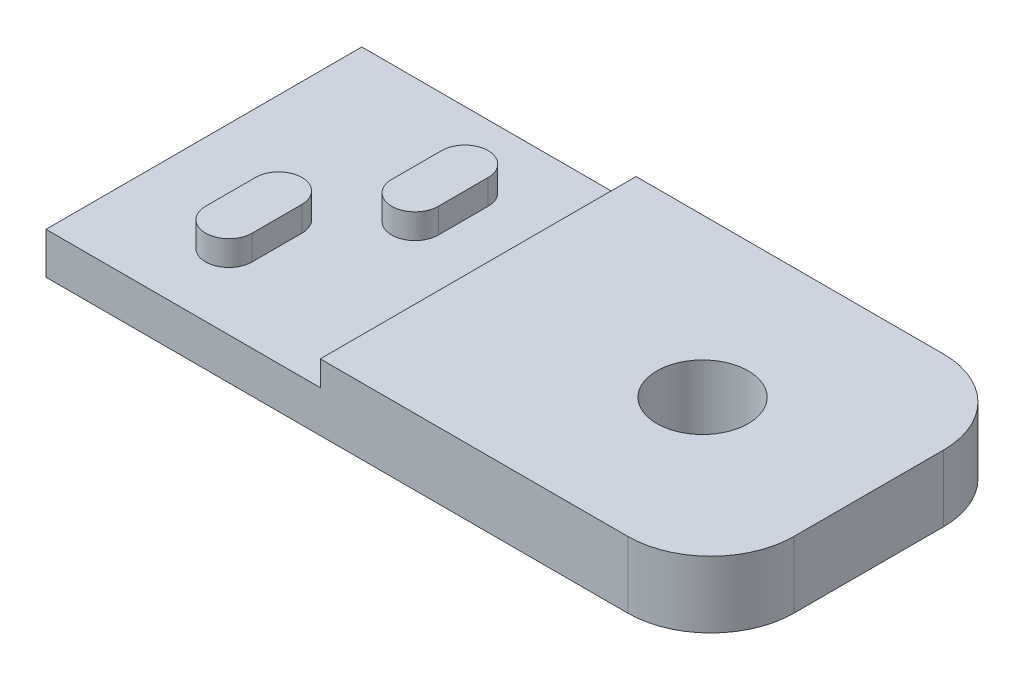
ISO-10303-21;
HEADER;
FILE_DESCRIPTION(('STEP AP214'),'2;1');
FILE_NAME('part.step','',(''),(''),'','','');
FILE_SCHEMA(('AUTOMOTIVE_DESIGN { 1 0 10303 214 1 1 1 1 }'));
ENDSEC;
DATA;
#1=APPLICATION_CONTEXT('core data for automotive mechanical design processes');
#2=APPLICATION_PROTOCOL_DEFINITION('international standard','automotive_design',2000,#1);
#3=PRODUCT_CONTEXT('',#1,'mechanical');
#4=PRODUCT('Part','Part','',(#3));
#5=PRODUCT_RELATED_PRODUCT_CATEGORY('part','',(#4));
#6=PRODUCT_DEFINITION_FORMATION('','',#4);
#7=PRODUCT_DEFINITION_CONTEXT('part definition',#1,'design');
#8=PRODUCT_DEFINITION('design','',#6,#7);
#9=PRODUCT_DEFINITION_SHAPE('','',#8);
#10=(LENGTH_UNIT() NAMED_UNIT(*) SI_UNIT(.MILLI.,.METRE.));
#11=(NAMED_UNIT(*) PLANE_ANGLE_UNIT() SI_UNIT($,.RADIAN.));
#12=(NAMED_UNIT(*) SI_UNIT($,.STERADIAN.) SOLID_ANGLE_UNIT());
#13=UNCERTAINTY_MEASURE_WITH_UNIT(LENGTH_MEASURE(1.E-05),#10,'distance_accuracy_value','');
#14=(GEOMETRIC_REPRESENTATION_CONTEXT(3) GLOBAL_UNCERTAINTY_ASSIGNED_CONTEXT((#13)) GLOBAL_UNIT_ASSIGNED_CONTEXT((#10,
#11,#12)) REPRESENTATION_CONTEXT('',''));
#15=CARTESIAN_POINT('',(0.,0.,0.));
#16=DIRECTION('',(0.,0.,1.));
#17=DIRECTION('',(1.,0.,0.));
#18=AXIS2_PLACEMENT_3D('',#15,#16,#17);
#19=CARTESIAN_POINT('',(-20.,4.,-9.5));
#20=DIRECTION('',(1.,0.,0.));
#21=DIRECTION('',(0.,0.,-1.));
#22=AXIS2_PLACEMENT_3D('',#19,#20,#21);
#23=PLANE('',#22);
#24=DIRECTION('',(0.,0.,1.));
#25=VECTOR('',#24,1.);
#26=CARTESIAN_POINT('',(-20.,2.5,-9.5));
#27=LINE('',#26,#25);
#28=CARTESIAN_POINT('',(-20.,2.5,-9.5));
#29=VERTEX_POINT('',#28);
#30=CARTESIAN_POINT('',(-20.,2.5,9.5));
#31=VERTEX_POINT('',#30);
#32=EDGE_CURVE('E227',#29,#31,#27,.T.);
#33=ORIENTED_EDGE('',*,*,#32,.F.);
#34=DIRECTION('',(0.,-1.,0.));
#35=VECTOR('',#34,1.);
#36=CARTESIAN_POINT('',(-20.,4.,-9.5));
#37=LINE('',#36,#35);
#38=CARTESIAN_POINT('',(-20.,0.,-9.5));
#39=VERTEX_POINT('',#38);
#40=EDGE_CURVE('E268',#29,#39,#37,.T.);
#41=ORIENTED_EDGE('',*,*,#40,.T.);
#42=DIRECTION('',(0.,0.,1.));
#43=VECTOR('',#42,1.);
#44=CARTESIAN_POINT('',(-20.,0.,-9.5));
#45=LINE('',#44,#43);
#46=CARTESIAN_POINT('',(-20.,0.,9.5));
#47=VERTEX_POINT('',#46);
#48=EDGE_CURVE('E263',#39,#47,#45,.T.);
#49=ORIENTED_EDGE('',*,*,#48,.T.);
#50=DIRECTION('',(0.,-1.,0.));
#51=VECTOR('',#50,1.);
#52=CARTESIAN_POINT('',(-20.,4.,9.5));
#53=LINE('',#52,#51);
#54=EDGE_CURVE('E258',#31,#47,#53,.T.);
#55=ORIENTED_EDGE('',*,*,#54,.F.);
#56=EDGE_LOOP('',(#33,#41,#49,#55));
#57=FACE_BOUND('',#56,.T.);
#58=ADVANCED_FACE('F33',(#57),#23,.F.);
#59=CARTESIAN_POINT('',(20.,4.,-9.5));
#60=DIRECTION('',(-1.,0.,0.));
#61=DIRECTION('',(0.,0.,1.));
#62=AXIS2_PLACEMENT_3D('',#59,#60,#61);
#63=PLANE('',#62);
#64=DIRECTION('',(0.,0.,-1.));
#65=VECTOR('',#64,1.);
#66=CARTESIAN_POINT('',(20.,4.,-9.5));
#67=LINE('',#66,#65);
#68=CARTESIAN_POINT('',(20.,4.,4.5));
#69=VERTEX_POINT('',#68);
#70=CARTESIAN_POINT('',(20.,4.,-4.5));
#71=VERTEX_POINT('',#70);
#72=EDGE_CURVE('E251',#69,#71,#67,.T.);
#73=ORIENTED_EDGE('',*,*,#72,.F.);
#74=DIRECTION('',(0.,-1.,0.));
#75=VECTOR('',#74,1.);
#76=CARTESIAN_POINT('',(20.,4.,4.5));
#77=LINE('',#76,#75);
#78=CARTESIAN_POINT('',(20.,0.,4.5));
#79=VERTEX_POINT('',#78);
#80=EDGE_CURVE('E273',#69,#79,#77,.T.);
#81=ORIENTED_EDGE('',*,*,#80,.T.);
#82=DIRECTION('',(0.,0.,-1.));
#83=VECTOR('',#82,1.);
#84=CARTESIAN_POINT('',(20.,0.,-9.5));
#85=LINE('',#84,#83);
#86=CARTESIAN_POINT('',(20.,0.,-4.5));
#87=VERTEX_POINT('',#86);
#88=EDGE_CURVE('E250',#79,#87,#85,.T.);
#89=ORIENTED_EDGE('',*,*,#88,.T.);
#90=DIRECTION('',(0.,-1.,0.));
#91=VECTOR('',#90,1.);
#92=CARTESIAN_POINT('',(20.,4.,-4.5));
#93=LINE('',#92,#91);
#94=EDGE_CURVE('E271',#87,#71,#93,.F.);
#95=ORIENTED_EDGE('',*,*,#94,.T.);
#96=EDGE_LOOP('',(#73,#81,#89,#95));
#97=FACE_BOUND('',#96,.T.);
#98=ADVANCED_FACE('F289',(#97),#63,.F.);
#99=CARTESIAN_POINT('',(-20.,4.,-9.5));
#100=DIRECTION('',(0.,0.,1.));
#101=DIRECTION('',(1.,0.,0.));
#102=AXIS2_PLACEMENT_3D('',#99,#100,#101);
#103=PLANE('',#102);
#104=DIRECTION('',(-1.,0.,0.));
#105=VECTOR('',#104,1.);
#106=CARTESIAN_POINT('',(-20.,4.,-9.5));
#107=LINE('',#106,#105);
#108=CARTESIAN_POINT('',(15.,4.,-9.5));
#109=VERTEX_POINT('',#108);
#110=CARTESIAN_POINT('',(-3.5,4.,-9.5));
#111=VERTEX_POINT('',#110);
#112=EDGE_CURVE('E253',#109,#111,#107,.T.);
#113=ORIENTED_EDGE('',*,*,#112,.F.);
#114=DIRECTION('',(0.,-1.,0.));
#115=VECTOR('',#114,1.);
#116=CARTESIAN_POINT('',(15.,4.,-9.5));
#117=LINE('',#116,#115);
#118=CARTESIAN_POINT('',(15.,0.,-9.5));
#119=VERTEX_POINT('',#118);
#120=EDGE_CURVE('E11',#109,#119,#117,.T.);
#121=ORIENTED_EDGE('',*,*,#120,.T.);
#122=DIRECTION('',(-1.,0.,0.));
#123=VECTOR('',#122,1.);
#124=CARTESIAN_POINT('',(-20.,0.,-9.5));
#125=LINE('',#124,#123);
#126=EDGE_CURVE('E261',#119,#39,#125,.T.);
#127=ORIENTED_EDGE('',*,*,#126,.T.);
#128=ORIENTED_EDGE('',*,*,#40,.F.);
#129=DIRECTION('',(-1.,0.,0.));
#130=VECTOR('',#129,1.);
#131=CARTESIAN_POINT('',(-20.,2.5,-9.5));
#132=LINE('',#131,#130);
#133=CARTESIAN_POINT('',(-3.5,2.5,-9.5));
#134=VERTEX_POINT('',#133);
#135=EDGE_CURVE('E235',#134,#29,#132,.T.);
#136=ORIENTED_EDGE('',*,*,#135,.F.);
#137=DIRECTION('',(0.,1.,0.));
#138=VECTOR('',#137,1.);
#139=CARTESIAN_POINT('',(-3.5,2.5,-9.5));
#140=LINE('',#139,#138);
#141=EDGE_CURVE('E240',#134,#111,#140,.T.);
#142=ORIENTED_EDGE('',*,*,#141,.T.);
#143=EDGE_LOOP('',(#113,#121,#127,#128,#136,#142));
#144=FACE_BOUND('',#143,.T.);
#145=ADVANCED_FACE('F306',(#144),#103,.F.);
#146=CARTESIAN_POINT('',(-20.,4.,9.5));
#147=DIRECTION('',(0.,0.,-1.));
#148=DIRECTION('',(-1.,0.,0.));
#149=AXIS2_PLACEMENT_3D('',#146,#147,#148);
#150=PLANE('',#149);
#151=DIRECTION('',(1.,0.,0.));
#152=VECTOR('',#151,1.);
#153=CARTESIAN_POINT('',(-20.,0.,9.5));
#154=LINE('',#153,#152);
#155=CARTESIAN_POINT('',(15.,0.,9.5));
#156=VERTEX_POINT('',#155);
#157=EDGE_CURVE('E254',#47,#156,#154,.T.);
#158=ORIENTED_EDGE('',*,*,#157,.T.);
#159=DIRECTION('',(0.,-1.,0.));
#160=VECTOR('',#159,1.);
#161=CARTESIAN_POINT('',(15.,4.,9.5));
#162=LINE('',#161,#160);
#163=CARTESIAN_POINT('',(15.,4.,9.5));
#164=VERTEX_POINT('',#163);
#165=EDGE_CURVE('E56',#156,#164,#162,.F.);
#166=ORIENTED_EDGE('',*,*,#165,.T.);
#167=DIRECTION('',(1.,0.,0.));
#168=VECTOR('',#167,1.);
#169=CARTESIAN_POINT('',(-20.,4.,9.5));
#170=LINE('',#169,#168);
#171=CARTESIAN_POINT('',(-3.5,4.,9.5));
#172=VERTEX_POINT('',#171);
#173=EDGE_CURVE('E256',#172,#164,#170,.T.);
#174=ORIENTED_EDGE('',*,*,#173,.F.);
#175=DIRECTION('',(0.,1.,0.));
#176=VECTOR('',#175,1.);
#177=CARTESIAN_POINT('',(-3.5,2.5,9.5));
#178=LINE('',#177,#176);
#179=CARTESIAN_POINT('',(-3.5,2.5,9.5));
#180=VERTEX_POINT('',#179);
#181=EDGE_CURVE('E237',#180,#172,#178,.T.);
#182=ORIENTED_EDGE('',*,*,#181,.F.);
#183=DIRECTION('',(1.,0.,0.));
#184=VECTOR('',#183,1.);
#185=CARTESIAN_POINT('',(-20.,2.5,9.5));
#186=LINE('',#185,#184);
#187=EDGE_CURVE('E229',#31,#180,#186,.T.);
#188=ORIENTED_EDGE('',*,*,#187,.F.);
#189=ORIENTED_EDGE('',*,*,#54,.T.);
#190=EDGE_LOOP('',(#158,#166,#174,#182,#188,#189));
#191=FACE_BOUND('',#190,.T.);
#192=ADVANCED_FACE('F297',(#191),#150,.F.);
#193=CARTESIAN_POINT('',(0.,4.,0.));
#194=DIRECTION('',(0.,1.,0.));
#195=DIRECTION('',(0.,0.,1.));
#196=AXIS2_PLACEMENT_3D('',#193,#194,#195);
#197=PLANE('',#196);
#198=ORIENTED_EDGE('',*,*,#173,.T.);
#199=CARTESIAN_POINT('',(15.,4.,4.5));
#200=DIRECTION('',(0.,1.,0.));
#201=DIRECTION('',(0.,0.,1.));
#202=AXIS2_PLACEMENT_3D('',#199,#200,#201);
#203=CIRCLE('',#202,5.);
#204=EDGE_CURVE('E41',#164,#69,#203,.T.);
#205=ORIENTED_EDGE('',*,*,#204,.T.);
#206=ORIENTED_EDGE('',*,*,#72,.T.);
#207=CARTESIAN_POINT('',(15.,4.,-4.5));
#208=DIRECTION('',(0.,1.,0.));
#209=DIRECTION('',(0.,0.,1.));
#210=AXIS2_PLACEMENT_3D('',#207,#208,#209);
#211=CIRCLE('',#210,5.);
#212=EDGE_CURVE('E48',#71,#109,#211,.T.);
#213=ORIENTED_EDGE('',*,*,#212,.T.);
#214=ORIENTED_EDGE('',*,*,#112,.T.);
#215=DIRECTION('',(0.,0.,-1.));
#216=VECTOR('',#215,1.);
#217=CARTESIAN_POINT('',(-3.5,4.,-9.5));
#218=LINE('',#217,#216);
#219=EDGE_CURVE('E220',#172,#111,#218,.T.);
#220=ORIENTED_EDGE('',*,*,#219,.F.);
#221=EDGE_LOOP('',(#198,#205,#206,#213,#214,#220));
#222=FACE_BOUND('',#221,.T.);
#223=CARTESIAN_POINT('',(10.,4.,0.));
#224=DIRECTION('',(0.,1.,0.));
#225=DIRECTION('',(0.,0.,1.));
#226=AXIS2_PLACEMENT_3D('',#223,#224,#225);
#227=CIRCLE('',#226,2.75);
#228=CARTESIAN_POINT('',(10.,4.,2.75));
#229=VERTEX_POINT('',#228);
#230=EDGE_CURVE('E243',#229,#229,#227,.T.);
#231=ORIENTED_EDGE('',*,*,#230,.F.);
#232=EDGE_LOOP('',(#231));
#233=FACE_BOUND('',#232,.T.);
#234=ADVANCED_FACE('F283',(#222,#233),#197,.T.);
#235=CARTESIAN_POINT('',(0.,0.,0.));
#236=DIRECTION('',(0.,1.,0.));
#237=DIRECTION('',(0.,0.,1.));
#238=AXIS2_PLACEMENT_3D('',#235,#236,#237);
#239=PLANE('',#238);
#240=CARTESIAN_POINT('',(10.,0.,0.));
#241=DIRECTION('',(0.,1.,0.));
#242=DIRECTION('',(0.,0.,1.));
#243=AXIS2_PLACEMENT_3D('',#240,#241,#242);
#244=CIRCLE('',#243,2.75);
#245=CARTESIAN_POINT('',(10.,0.,2.75));
#246=VERTEX_POINT('',#245);
#247=EDGE_CURVE('E247',#246,#246,#244,.F.);
#248=ORIENTED_EDGE('',*,*,#247,.F.);
#249=EDGE_LOOP('',(#248));
#250=FACE_BOUND('',#249,.T.);
#251=ORIENTED_EDGE('',*,*,#88,.F.);
#252=CARTESIAN_POINT('',(15.,0.,4.5));
#253=DIRECTION('',(0.,1.,0.));
#254=DIRECTION('',(0.,0.,1.));
#255=AXIS2_PLACEMENT_3D('',#252,#253,#254);
#256=CIRCLE('',#255,5.);
#257=EDGE_CURVE('E278',#79,#156,#256,.F.);
#258=ORIENTED_EDGE('',*,*,#257,.T.);
#259=ORIENTED_EDGE('',*,*,#157,.F.);
#260=ORIENTED_EDGE('',*,*,#48,.F.);
#261=ORIENTED_EDGE('',*,*,#126,.F.);
#262=CARTESIAN_POINT('',(15.,0.,-4.5));
#263=DIRECTION('',(0.,1.,0.));
#264=DIRECTION('',(0.,0.,1.));
#265=AXIS2_PLACEMENT_3D('',#262,#263,#264);
#266=CIRCLE('',#265,5.);
#267=EDGE_CURVE('E276',#119,#87,#266,.F.);
#268=ORIENTED_EDGE('',*,*,#267,.T.);
#269=EDGE_LOOP('',(#251,#258,#259,#260,#261,#268));
#270=FACE_BOUND('',#269,.T.);
#271=ADVANCED_FACE('F295',(#250,#270),#239,.F.);
#272=CARTESIAN_POINT('',(10.,-0.00100000000000013,0.));
#273=DIRECTION('',(0.,1.,0.));
#274=DIRECTION('',(0.,0.,1.));
#275=AXIS2_PLACEMENT_3D('',#272,#273,#274);
#276=CYLINDRICAL_SURFACE('',#275,2.75);
#277=ORIENTED_EDGE('',*,*,#230,.T.);
#278=EDGE_LOOP('',(#277));
#279=FACE_BOUND('',#278,.T.);
#280=ORIENTED_EDGE('',*,*,#247,.T.);
#281=EDGE_LOOP('',(#280));
#282=FACE_BOUND('',#281,.T.);
#283=ADVANCED_FACE('F336',(#279,#282),#276,.F.);
#284=CARTESIAN_POINT('',(-3.5,2.5,-9.5));
#285=DIRECTION('',(1.,0.,0.));
#286=DIRECTION('',(0.,0.,-1.));
#287=AXIS2_PLACEMENT_3D('',#284,#285,#286);
#288=PLANE('',#287);
#289=ORIENTED_EDGE('',*,*,#219,.T.);
#290=ORIENTED_EDGE('',*,*,#141,.F.);
#291=DIRECTION('',(0.,0.,-1.));
#292=VECTOR('',#291,1.);
#293=CARTESIAN_POINT('',(-3.5,2.5,-9.5));
#294=LINE('',#293,#292);
#295=EDGE_CURVE('E232',#180,#134,#294,.T.);
#296=ORIENTED_EDGE('',*,*,#295,.F.);
#297=ORIENTED_EDGE('',*,*,#181,.T.);
#298=EDGE_LOOP('',(#289,#290,#296,#297));
#299=FACE_BOUND('',#298,.T.);
#300=ADVANCED_FACE('F379',(#299),#288,.F.);
#301=CARTESIAN_POINT('',(0.,2.5,0.));
#302=DIRECTION('',(0.,1.,0.));
#303=DIRECTION('',(0.,0.,1.));
#304=AXIS2_PLACEMENT_3D('',#301,#302,#303);
#305=PLANE('',#304);
#306=DIRECTION('',(0.,0.,-1.));
#307=VECTOR('',#306,1.);
#308=CARTESIAN_POINT('',(-12.1,2.5,2.));
#309=LINE('',#308,#307);
#310=CARTESIAN_POINT('',(-12.1,2.5,5.));
#311=VERTEX_POINT('',#310);
#312=CARTESIAN_POINT('',(-12.1,2.5,2.));
#313=VERTEX_POINT('',#312);
#314=EDGE_CURVE('E161',#311,#313,#309,.T.);
#315=ORIENTED_EDGE('',*,*,#314,.F.);
#316=CARTESIAN_POINT('',(-13.5,2.5,5.));
#317=DIRECTION('',(0.,1.,0.));
#318=DIRECTION('',(0.,0.,1.));
#319=AXIS2_PLACEMENT_3D('',#316,#317,#318);
#320=CIRCLE('',#319,1.4);
#321=CARTESIAN_POINT('',(-14.9,2.5,5.));
#322=VERTEX_POINT('',#321);
#323=EDGE_CURVE('E171',#322,#311,#320,.T.);
#324=ORIENTED_EDGE('',*,*,#323,.F.);
#325=DIRECTION('',(0.,0.,1.));
#326=VECTOR('',#325,1.);
#327=CARTESIAN_POINT('',(-14.9,2.5,2.));
#328=LINE('',#327,#326);
#329=CARTESIAN_POINT('',(-14.9,2.5,2.));
#330=VERTEX_POINT('',#329);
#331=EDGE_CURVE('E153',#330,#322,#328,.T.);
#332=ORIENTED_EDGE('',*,*,#331,.F.);
#333=CARTESIAN_POINT('',(-13.5,2.5,2.));
#334=DIRECTION('',(0.,1.,0.));
#335=DIRECTION('',(0.,0.,1.));
#336=AXIS2_PLACEMENT_3D('',#333,#334,#335);
#337=CIRCLE('',#336,1.4);
#338=EDGE_CURVE('E168',#313,#330,#337,.T.);
#339=ORIENTED_EDGE('',*,*,#338,.F.);
#340=EDGE_LOOP('',(#315,#324,#332,#339));
#341=FACE_BOUND('',#340,.T.);
#342=DIRECTION('',(0.,0.,-1.));
#343=VECTOR('',#342,1.);
#344=CARTESIAN_POINT('',(-7.9,2.5,-5.));
#345=LINE('',#344,#343);
#346=CARTESIAN_POINT('',(-7.9,2.5,-2.));
#347=VERTEX_POINT('',#346);
#348=CARTESIAN_POINT('',(-7.9,2.5,-5.));
#349=VERTEX_POINT('',#348);
#350=EDGE_CURVE('E204',#347,#349,#345,.T.);
#351=ORIENTED_EDGE('',*,*,#350,.F.);
#352=CARTESIAN_POINT('',(-9.3,2.5,-2.));
#353=DIRECTION('',(0.,1.,0.));
#354=DIRECTION('',(0.,0.,1.));
#355=AXIS2_PLACEMENT_3D('',#352,#353,#354);
#356=CIRCLE('',#355,1.4);
#357=CARTESIAN_POINT('',(-10.7,2.5,-2.));
#358=VERTEX_POINT('',#357);
#359=EDGE_CURVE('E201',#358,#347,#356,.T.);
#360=ORIENTED_EDGE('',*,*,#359,.F.);
#361=DIRECTION('',(0.,0.,1.));
#362=VECTOR('',#361,1.);
#363=CARTESIAN_POINT('',(-10.7,2.5,-5.));
#364=LINE('',#363,#362);
#365=CARTESIAN_POINT('',(-10.7,2.5,-5.));
#366=VERTEX_POINT('',#365);
#367=EDGE_CURVE('E197',#366,#358,#364,.T.);
#368=ORIENTED_EDGE('',*,*,#367,.F.);
#369=CARTESIAN_POINT('',(-9.3,2.5,-5.));
#370=DIRECTION('',(0.,1.,0.));
#371=DIRECTION('',(0.,0.,1.));
#372=AXIS2_PLACEMENT_3D('',#369,#370,#371);
#373=CIRCLE('',#372,1.4);
#374=EDGE_CURVE('E194',#349,#366,#373,.T.);
#375=ORIENTED_EDGE('',*,*,#374,.F.);
#376=EDGE_LOOP('',(#351,#360,#368,#375));
#377=FACE_BOUND('',#376,.T.);
#378=ORIENTED_EDGE('',*,*,#32,.T.);
#379=ORIENTED_EDGE('',*,*,#187,.T.);
#380=ORIENTED_EDGE('',*,*,#295,.T.);
#381=ORIENTED_EDGE('',*,*,#135,.T.);
#382=EDGE_LOOP('',(#378,#379,#380,#381));
#383=FACE_BOUND('',#382,.T.);
#384=ADVANCED_FACE('F166',(#341,#377,#383),#305,.T.);
#385=CARTESIAN_POINT('',(-9.3,2.5,-5.));
#386=DIRECTION('',(0.,1.,0.));
#387=DIRECTION('',(0.,0.,1.));
#388=AXIS2_PLACEMENT_3D('',#385,#386,#387);
#389=CYLINDRICAL_SURFACE('',#388,1.4);
#390=CARTESIAN_POINT('',(-9.3,4.,-5.));
#391=DIRECTION('',(0.,1.,0.));
#392=DIRECTION('',(0.,0.,1.));
#393=AXIS2_PLACEMENT_3D('',#390,#391,#392);
#394=CIRCLE('',#393,1.4);
#395=CARTESIAN_POINT('',(-7.9,4.,-5.));
#396=VERTEX_POINT('',#395);
#397=CARTESIAN_POINT('',(-10.7,4.,-5.));
#398=VERTEX_POINT('',#397);
#399=EDGE_CURVE('E190',#396,#398,#394,.T.);
#400=ORIENTED_EDGE('',*,*,#399,.F.);
#401=DIRECTION('',(0.,1.,0.));
#402=VECTOR('',#401,1.);
#403=CARTESIAN_POINT('',(-7.9,2.5,-5.));
#404=LINE('',#403,#402);
#405=EDGE_CURVE('E218',#349,#396,#404,.T.);
#406=ORIENTED_EDGE('',*,*,#405,.F.);
#407=ORIENTED_EDGE('',*,*,#374,.T.);
#408=DIRECTION('',(0.,1.,0.));
#409=VECTOR('',#408,1.);
#410=CARTESIAN_POINT('',(-10.7,2.5,-5.));
#411=LINE('',#410,#409);
#412=EDGE_CURVE('E207',#366,#398,#411,.T.);
#413=ORIENTED_EDGE('',*,*,#412,.T.);
#414=EDGE_LOOP('',(#400,#406,#407,#413));
#415=FACE_BOUND('',#414,.T.);
#416=ADVANCED_FACE('F366',(#415),#389,.T.);
#417=CARTESIAN_POINT('',(-7.9,2.5,-5.));
#418=DIRECTION('',(1.,0.,0.));
#419=DIRECTION('',(0.,0.,-1.));
#420=AXIS2_PLACEMENT_3D('',#417,#418,#419);
#421=PLANE('',#420);
#422=DIRECTION('',(0.,0.,-1.));
#423=VECTOR('',#422,1.);
#424=CARTESIAN_POINT('',(-7.9,4.,-5.));
#425=LINE('',#424,#423);
#426=CARTESIAN_POINT('',(-7.9,4.,-2.));
#427=VERTEX_POINT('',#426);
#428=EDGE_CURVE('E198',#427,#396,#425,.T.);
#429=ORIENTED_EDGE('',*,*,#428,.F.);
#430=DIRECTION('',(0.,1.,0.));
#431=VECTOR('',#430,1.);
#432=CARTESIAN_POINT('',(-7.9,2.5,-2.));
#433=LINE('',#432,#431);
#434=EDGE_CURVE('E221',#347,#427,#433,.T.);
#435=ORIENTED_EDGE('',*,*,#434,.F.);
#436=ORIENTED_EDGE('',*,*,#350,.T.);
#437=ORIENTED_EDGE('',*,*,#405,.T.);
#438=EDGE_LOOP('',(#429,#435,#436,#437));
#439=FACE_BOUND('',#438,.T.);
#440=ADVANCED_FACE('F362',(#439),#421,.T.);
#441=CARTESIAN_POINT('',(-9.3,2.5,-2.));
#442=DIRECTION('',(0.,1.,0.));
#443=DIRECTION('',(0.,0.,1.));
#444=AXIS2_PLACEMENT_3D('',#441,#442,#443);
#445=CYLINDRICAL_SURFACE('',#444,1.4);
#446=CARTESIAN_POINT('',(-9.3,4.,-2.));
#447=DIRECTION('',(0.,1.,0.));
#448=DIRECTION('',(0.,0.,1.));
#449=AXIS2_PLACEMENT_3D('',#446,#447,#448);
#450=CIRCLE('',#449,1.4);
#451=CARTESIAN_POINT('',(-10.7,4.,-2.));
#452=VERTEX_POINT('',#451);
#453=EDGE_CURVE('E213',#452,#427,#450,.T.);
#454=ORIENTED_EDGE('',*,*,#453,.F.);
#455=DIRECTION('',(0.,1.,0.));
#456=VECTOR('',#455,1.);
#457=CARTESIAN_POINT('',(-10.7,2.5,-2.));
#458=LINE('',#457,#456);
#459=EDGE_CURVE('E223',#358,#452,#458,.T.);
#460=ORIENTED_EDGE('',*,*,#459,.F.);
#461=ORIENTED_EDGE('',*,*,#359,.T.);
#462=ORIENTED_EDGE('',*,*,#434,.T.);
#463=EDGE_LOOP('',(#454,#460,#461,#462));
#464=FACE_BOUND('',#463,.T.);
#465=ADVANCED_FACE('F365',(#464),#445,.T.);
#466=CARTESIAN_POINT('',(-10.7,2.5,-5.));
#467=DIRECTION('',(-1.,0.,0.));
#468=DIRECTION('',(0.,0.,1.));
#469=AXIS2_PLACEMENT_3D('',#466,#467,#468);
#470=PLANE('',#469);
#471=DIRECTION('',(0.,0.,1.));
#472=VECTOR('',#471,1.);
#473=CARTESIAN_POINT('',(-10.7,4.,-5.));
#474=LINE('',#473,#472);
#475=EDGE_CURVE('E210',#398,#452,#474,.T.);
#476=ORIENTED_EDGE('',*,*,#475,.F.);
#477=ORIENTED_EDGE('',*,*,#412,.F.);
#478=ORIENTED_EDGE('',*,*,#367,.T.);
#479=ORIENTED_EDGE('',*,*,#459,.T.);
#480=EDGE_LOOP('',(#476,#477,#478,#479));
#481=FACE_BOUND('',#480,.T.);
#482=ADVANCED_FACE('F361',(#481),#470,.T.);
#483=CARTESIAN_POINT('',(-13.5,2.5,2.));
#484=DIRECTION('',(0.,1.,0.));
#485=DIRECTION('',(0.,0.,1.));
#486=AXIS2_PLACEMENT_3D('',#483,#484,#485);
#487=CYLINDRICAL_SURFACE('',#486,1.4);
#488=CARTESIAN_POINT('',(-13.5,4.,2.));
#489=DIRECTION('',(0.,1.,0.));
#490=DIRECTION('',(0.,0.,1.));
#491=AXIS2_PLACEMENT_3D('',#488,#489,#490);
#492=CIRCLE('',#491,1.4);
#493=CARTESIAN_POINT('',(-12.1,4.,2.));
#494=VERTEX_POINT('',#493);
#495=CARTESIAN_POINT('',(-14.9,4.,2.));
#496=VERTEX_POINT('',#495);
#497=EDGE_CURVE('E184',#494,#496,#492,.T.);
#498=ORIENTED_EDGE('',*,*,#497,.F.);
#499=DIRECTION('',(0.,1.,0.));
#500=VECTOR('',#499,1.);
#501=CARTESIAN_POINT('',(-12.1,2.5,2.));
#502=LINE('',#501,#500);
#503=EDGE_CURVE('E175',#313,#494,#502,.T.);
#504=ORIENTED_EDGE('',*,*,#503,.F.);
#505=ORIENTED_EDGE('',*,*,#338,.T.);
#506=DIRECTION('',(0.,1.,0.));
#507=VECTOR('',#506,1.);
#508=CARTESIAN_POINT('',(-14.9,2.5,2.));
#509=LINE('',#508,#507);
#510=EDGE_CURVE('E149',#330,#496,#509,.T.);
#511=ORIENTED_EDGE('',*,*,#510,.T.);
#512=EDGE_LOOP('',(#498,#504,#505,#511));
#513=FACE_BOUND('',#512,.T.);
#514=ADVANCED_FACE('F174',(#513),#487,.T.);
#515=CARTESIAN_POINT('',(-12.1,2.5,2.));
#516=DIRECTION('',(1.,0.,0.));
#517=DIRECTION('',(0.,0.,-1.));
#518=AXIS2_PLACEMENT_3D('',#515,#516,#517);
#519=PLANE('',#518);
#520=DIRECTION('',(0.,0.,-1.));
#521=VECTOR('',#520,1.);
#522=CARTESIAN_POINT('',(-12.1,4.,2.));
#523=LINE('',#522,#521);
#524=CARTESIAN_POINT('',(-12.1,4.,5.));
#525=VERTEX_POINT('',#524);
#526=EDGE_CURVE('E176',#525,#494,#523,.T.);
#527=ORIENTED_EDGE('',*,*,#526,.F.);
#528=DIRECTION('',(0.,1.,0.));
#529=VECTOR('',#528,1.);
#530=CARTESIAN_POINT('',(-12.1,2.5,5.));
#531=LINE('',#530,#529);
#532=EDGE_CURVE('E191',#311,#525,#531,.T.);
#533=ORIENTED_EDGE('',*,*,#532,.F.);
#534=ORIENTED_EDGE('',*,*,#314,.T.);
#535=ORIENTED_EDGE('',*,*,#503,.T.);
#536=EDGE_LOOP('',(#527,#533,#534,#535));
#537=FACE_BOUND('',#536,.T.);
#538=ADVANCED_FACE('F347',(#537),#519,.T.);
#539=CARTESIAN_POINT('',(-13.5,2.5,5.));
#540=DIRECTION('',(0.,1.,0.));
#541=DIRECTION('',(0.,0.,1.));
#542=AXIS2_PLACEMENT_3D('',#539,#540,#541);
#543=CYLINDRICAL_SURFACE('',#542,1.4);
#544=CARTESIAN_POINT('',(-13.5,4.,5.));
#545=DIRECTION('',(0.,1.,0.));
#546=DIRECTION('',(0.,0.,1.));
#547=AXIS2_PLACEMENT_3D('',#544,#545,#546);
#548=CIRCLE('',#547,1.4);
#549=CARTESIAN_POINT('',(-14.9,4.,5.));
#550=VERTEX_POINT('',#549);
#551=EDGE_CURVE('E179',#550,#525,#548,.T.);
#552=ORIENTED_EDGE('',*,*,#551,.F.);
#553=DIRECTION('',(0.,1.,0.));
#554=VECTOR('',#553,1.);
#555=CARTESIAN_POINT('',(-14.9,2.5,5.));
#556=LINE('',#555,#554);
#557=EDGE_CURVE('E160',#322,#550,#556,.T.);
#558=ORIENTED_EDGE('',*,*,#557,.F.);
#559=ORIENTED_EDGE('',*,*,#323,.T.);
#560=ORIENTED_EDGE('',*,*,#532,.T.);
#561=EDGE_LOOP('',(#552,#558,#559,#560));
#562=FACE_BOUND('',#561,.T.);
#563=ADVANCED_FACE('F349',(#562),#543,.T.);
#564=CARTESIAN_POINT('',(-14.9,2.5,2.));
#565=DIRECTION('',(-1.,0.,0.));
#566=DIRECTION('',(0.,0.,1.));
#567=AXIS2_PLACEMENT_3D('',#564,#565,#566);
#568=PLANE('',#567);
#569=DIRECTION('',(0.,0.,1.));
#570=VECTOR('',#569,1.);
#571=CARTESIAN_POINT('',(-14.9,4.,2.));
#572=LINE('',#571,#570);
#573=EDGE_CURVE('E155',#496,#550,#572,.T.);
#574=ORIENTED_EDGE('',*,*,#573,.F.);
#575=ORIENTED_EDGE('',*,*,#510,.F.);
#576=ORIENTED_EDGE('',*,*,#331,.T.);
#577=ORIENTED_EDGE('',*,*,#557,.T.);
#578=EDGE_LOOP('',(#574,#575,#576,#577));
#579=FACE_BOUND('',#578,.T.);
#580=ADVANCED_FACE('F151',(#579),#568,.T.);
#581=ORIENTED_EDGE('',*,*,#428,.T.);
#582=ORIENTED_EDGE('',*,*,#399,.T.);
#583=ORIENTED_EDGE('',*,*,#475,.T.);
#584=ORIENTED_EDGE('',*,*,#453,.T.);
#585=EDGE_LOOP('',(#581,#582,#583,#584));
#586=FACE_BOUND('',#585,.T.);
#587=ADVANCED_FACE('F332',(#586),#197,.T.);
#588=ORIENTED_EDGE('',*,*,#526,.T.);
#589=ORIENTED_EDGE('',*,*,#497,.T.);
#590=ORIENTED_EDGE('',*,*,#573,.T.);
#591=ORIENTED_EDGE('',*,*,#551,.T.);
#592=EDGE_LOOP('',(#588,#589,#590,#591));
#593=FACE_BOUND('',#592,.T.);
#594=ADVANCED_FACE('F314',(#593),#197,.T.);
#595=CARTESIAN_POINT('',(15.,4.,4.5));
#596=DIRECTION('',(0.,-1.,0.));
#597=DIRECTION('',(0.,0.,-1.));
#598=AXIS2_PLACEMENT_3D('',#595,#596,#597);
#599=CYLINDRICAL_SURFACE('',#598,5.);
#600=ORIENTED_EDGE('',*,*,#204,.F.);
#601=ORIENTED_EDGE('',*,*,#165,.F.);
#602=ORIENTED_EDGE('',*,*,#257,.F.);
#603=ORIENTED_EDGE('',*,*,#80,.F.);
#604=EDGE_LOOP('',(#600,#601,#602,#603));
#605=FACE_BOUND('',#604,.T.);
#606=ADVANCED_FACE('F292',(#605),#599,.T.);
#607=CARTESIAN_POINT('',(15.,4.,-4.5));
#608=DIRECTION('',(0.,-1.,0.));
#609=DIRECTION('',(0.,0.,-1.));
#610=AXIS2_PLACEMENT_3D('',#607,#608,#609);
#611=CYLINDRICAL_SURFACE('',#610,5.);
#612=ORIENTED_EDGE('',*,*,#212,.F.);
#613=ORIENTED_EDGE('',*,*,#94,.F.);
#614=ORIENTED_EDGE('',*,*,#267,.F.);
#615=ORIENTED_EDGE('',*,*,#120,.F.);
#616=EDGE_LOOP('',(#612,#613,#614,#615));
#617=FACE_BOUND('',#616,.T.);
#618=ADVANCED_FACE('F35',(#617),#611,.T.);
#619=CLOSED_SHELL('',(#58,#98,#145,#192,#234,#271,#283,#300,#384,#416,#440,#465,#482,#514,#538,
#563,#580,#587,#594,#606,#618));
#620=MANIFOLD_SOLID_BREP('B2',#619);
#621=ADVANCED_BREP_SHAPE_REPRESENTATION('',(#18,#620),#14);
#622=SHAPE_DEFINITION_REPRESENTATION(#9,#621);
ENDSEC;
END-ISO-10303-21;
